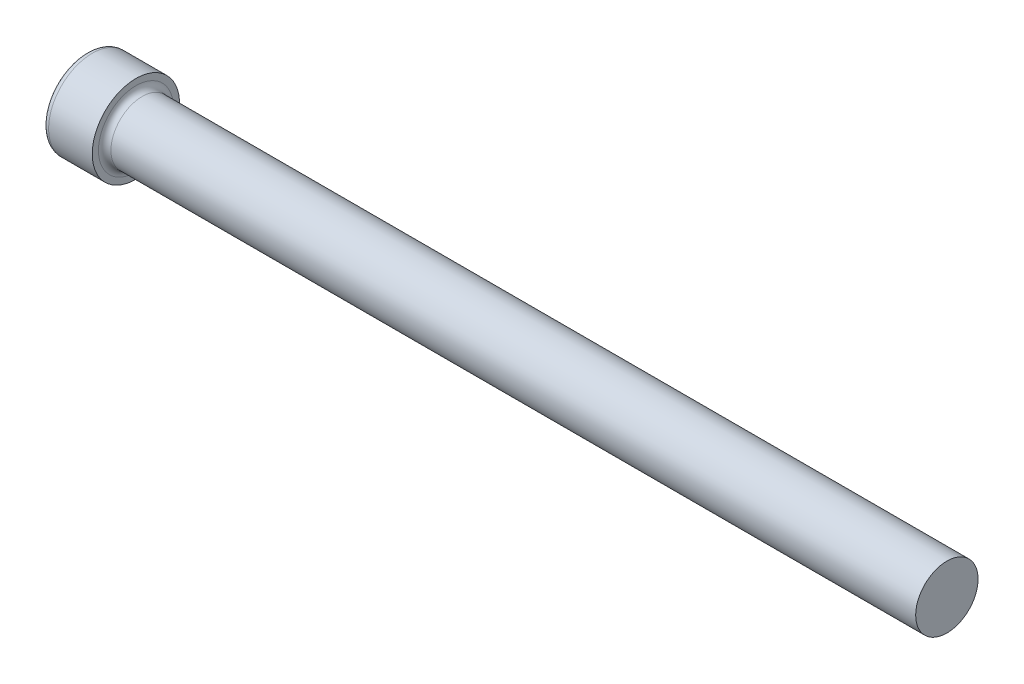
ISO-10303-21;
HEADER;
FILE_DESCRIPTION(('STEP AP214'),'2;1');
FILE_NAME('part.step','',(''),(''),'','','');
FILE_SCHEMA(('AUTOMOTIVE_DESIGN { 1 0 10303 214 1 1 1 1 }'));
ENDSEC;
DATA;
#1=APPLICATION_CONTEXT('core data for automotive mechanical design processes');
#2=APPLICATION_PROTOCOL_DEFINITION('international standard','automotive_design',2000,#1);
#3=PRODUCT_CONTEXT('',#1,'mechanical');
#4=PRODUCT('Part','Part','',(#3));
#5=PRODUCT_RELATED_PRODUCT_CATEGORY('part','',(#4));
#6=PRODUCT_DEFINITION_FORMATION('','',#4);
#7=PRODUCT_DEFINITION_CONTEXT('part definition',#1,'design');
#8=PRODUCT_DEFINITION('design','',#6,#7);
#9=PRODUCT_DEFINITION_SHAPE('','',#8);
#10=(LENGTH_UNIT() NAMED_UNIT(*) SI_UNIT(.MILLI.,.METRE.));
#11=(NAMED_UNIT(*) PLANE_ANGLE_UNIT() SI_UNIT($,.RADIAN.));
#12=(NAMED_UNIT(*) SI_UNIT($,.STERADIAN.) SOLID_ANGLE_UNIT());
#13=UNCERTAINTY_MEASURE_WITH_UNIT(LENGTH_MEASURE(1.E-05),#10,'distance_accuracy_value','');
#14=(GEOMETRIC_REPRESENTATION_CONTEXT(3) GLOBAL_UNCERTAINTY_ASSIGNED_CONTEXT((#13)) GLOBAL_UNIT_ASSIGNED_CONTEXT((#10,
#11,#12)) REPRESENTATION_CONTEXT('',''));
#15=CARTESIAN_POINT('',(0.,0.,0.));
#16=DIRECTION('',(0.,0.,1.));
#17=DIRECTION('',(1.,0.,0.));
#18=AXIS2_PLACEMENT_3D('',#15,#16,#17);
#19=CARTESIAN_POINT('',(2.,-1.73205080756888,0.));
#20=DIRECTION('',(0.,-0.866025403784439,0.5));
#21=DIRECTION('',(0.,-0.5,-0.866025403784439));
#22=AXIS2_PLACEMENT_3D('',#19,#20,#21);
#23=PLANE('',#22);
#24=DIRECTION('',(1.,0.,0.));
#25=VECTOR('',#24,1.);
#26=CARTESIAN_POINT('',(2.,-0.866025403784439,1.5));
#27=LINE('',#26,#25);
#28=CARTESIAN_POINT('',(0.,-0.86602540378444,1.5));
#29=VERTEX_POINT('',#28);
#30=CARTESIAN_POINT('',(2.,-0.86602540378444,1.5));
#31=VERTEX_POINT('',#30);
#32=EDGE_CURVE('E97',#29,#31,#27,.T.);
#33=ORIENTED_EDGE('',*,*,#32,.T.);
#34=DIRECTION('',(0.,-0.5,-0.866025403784439));
#35=VECTOR('',#34,1.);
#36=CARTESIAN_POINT('',(2.,-1.73205080756888,0.));
#37=LINE('',#36,#35);
#38=CARTESIAN_POINT('',(2.,-1.73205080756888,0.));
#39=VERTEX_POINT('',#38);
#40=EDGE_CURVE('E86',#39,#31,#37,.F.);
#41=ORIENTED_EDGE('',*,*,#40,.F.);
#42=DIRECTION('',(1.,0.,0.));
#43=VECTOR('',#42,1.);
#44=CARTESIAN_POINT('',(2.,-1.73205080756888,0.));
#45=LINE('',#44,#43);
#46=CARTESIAN_POINT('',(0.,-1.73205080756888,0.));
#47=VERTEX_POINT('',#46);
#48=EDGE_CURVE('E106',#39,#47,#45,.F.);
#49=ORIENTED_EDGE('',*,*,#48,.T.);
#50=DIRECTION('',(0.,-0.5,-0.866025403784439));
#51=VECTOR('',#50,1.);
#52=CARTESIAN_POINT('',(0.,-1.73205080756888,0.));
#53=LINE('',#52,#51);
#54=EDGE_CURVE('E81',#29,#47,#53,.T.);
#55=ORIENTED_EDGE('',*,*,#54,.F.);
#56=EDGE_LOOP('',(#33,#41,#49,#55));
#57=FACE_BOUND('',#56,.T.);
#58=ADVANCED_FACE('F17',(#57),#23,.F.);
#59=CARTESIAN_POINT('',(2.,-0.866025403784439,1.5));
#60=DIRECTION('',(0.,0.,1.));
#61=DIRECTION('',(0.,-1.,0.));
#62=AXIS2_PLACEMENT_3D('',#59,#60,#61);
#63=PLANE('',#62);
#64=DIRECTION('',(1.,0.,0.));
#65=VECTOR('',#64,1.);
#66=CARTESIAN_POINT('',(2.,0.866025403784439,1.5));
#67=LINE('',#66,#65);
#68=CARTESIAN_POINT('',(0.,0.866025403784439,1.5));
#69=VERTEX_POINT('',#68);
#70=CARTESIAN_POINT('',(2.,0.866025403784439,1.5));
#71=VERTEX_POINT('',#70);
#72=EDGE_CURVE('E102',#69,#71,#67,.T.);
#73=ORIENTED_EDGE('',*,*,#72,.T.);
#74=DIRECTION('',(0.,-1.,0.));
#75=VECTOR('',#74,1.);
#76=CARTESIAN_POINT('',(2.,-0.866025403784439,1.5));
#77=LINE('',#76,#75);
#78=EDGE_CURVE('E90',#31,#71,#77,.F.);
#79=ORIENTED_EDGE('',*,*,#78,.F.);
#80=ORIENTED_EDGE('',*,*,#32,.F.);
#81=DIRECTION('',(0.,-1.,0.));
#82=VECTOR('',#81,1.);
#83=CARTESIAN_POINT('',(0.,-0.866025403784439,1.5));
#84=LINE('',#83,#82);
#85=EDGE_CURVE('E104',#69,#29,#84,.T.);
#86=ORIENTED_EDGE('',*,*,#85,.F.);
#87=EDGE_LOOP('',(#73,#79,#80,#86));
#88=FACE_BOUND('',#87,.T.);
#89=ADVANCED_FACE('F100',(#88),#63,.F.);
#90=CARTESIAN_POINT('',(2.,-0.866025403784439,-1.5));
#91=DIRECTION('',(0.,-0.866025403784439,-0.5));
#92=DIRECTION('',(0.,0.5,-0.866025403784439));
#93=AXIS2_PLACEMENT_3D('',#90,#91,#92);
#94=PLANE('',#93);
#95=ORIENTED_EDGE('',*,*,#48,.F.);
#96=DIRECTION('',(0.,-0.500000000000001,0.866025403784438));
#97=VECTOR('',#96,1.);
#98=CARTESIAN_POINT('',(2.,-0.866025403784439,-1.5));
#99=LINE('',#98,#97);
#100=CARTESIAN_POINT('',(2.,-0.866025403784439,-1.5));
#101=VERTEX_POINT('',#100);
#102=EDGE_CURVE('E93',#101,#39,#99,.T.);
#103=ORIENTED_EDGE('',*,*,#102,.F.);
#104=DIRECTION('',(1.,0.,0.));
#105=VECTOR('',#104,1.);
#106=CARTESIAN_POINT('',(2.,-0.866025403784439,-1.5));
#107=LINE('',#106,#105);
#108=CARTESIAN_POINT('',(0.,-0.866025403784439,-1.5));
#109=VERTEX_POINT('',#108);
#110=EDGE_CURVE('E212',#101,#109,#107,.F.);
#111=ORIENTED_EDGE('',*,*,#110,.T.);
#112=DIRECTION('',(0.,0.5,-0.866025403784439));
#113=VECTOR('',#112,1.);
#114=CARTESIAN_POINT('',(0.,-0.866025403784439,-1.5));
#115=LINE('',#114,#113);
#116=EDGE_CURVE('E224',#47,#109,#115,.T.);
#117=ORIENTED_EDGE('',*,*,#116,.F.);
#118=EDGE_LOOP('',(#95,#103,#111,#117));
#119=FACE_BOUND('',#118,.T.);
#120=ADVANCED_FACE('F227',(#119),#94,.F.);
#121=CARTESIAN_POINT('',(2.,0.866025403784439,1.5));
#122=DIRECTION('',(0.,0.866025403784439,0.5));
#123=DIRECTION('',(0.,-0.5,0.866025403784439));
#124=AXIS2_PLACEMENT_3D('',#121,#122,#123);
#125=PLANE('',#124);
#126=DIRECTION('',(1.,0.,0.));
#127=VECTOR('',#126,1.);
#128=CARTESIAN_POINT('',(2.,1.73205080756888,0.));
#129=LINE('',#128,#127);
#130=CARTESIAN_POINT('',(0.,1.73205080756888,0.));
#131=VERTEX_POINT('',#130);
#132=CARTESIAN_POINT('',(2.,1.73205080756888,0.));
#133=VERTEX_POINT('',#132);
#134=EDGE_CURVE('E208',#131,#133,#129,.T.);
#135=ORIENTED_EDGE('',*,*,#134,.T.);
#136=DIRECTION('',(0.,0.500000000000001,-0.866025403784438));
#137=VECTOR('',#136,1.);
#138=CARTESIAN_POINT('',(2.,0.866025403784439,1.5));
#139=LINE('',#138,#137);
#140=EDGE_CURVE('E218',#71,#133,#139,.T.);
#141=ORIENTED_EDGE('',*,*,#140,.F.);
#142=ORIENTED_EDGE('',*,*,#72,.F.);
#143=DIRECTION('',(0.,-0.5,0.866025403784439));
#144=VECTOR('',#143,1.);
#145=CARTESIAN_POINT('',(0.,0.866025403784439,1.5));
#146=LINE('',#145,#144);
#147=EDGE_CURVE('E220',#131,#69,#146,.T.);
#148=ORIENTED_EDGE('',*,*,#147,.F.);
#149=EDGE_LOOP('',(#135,#141,#142,#148));
#150=FACE_BOUND('',#149,.T.);
#151=ADVANCED_FACE('F236',(#150),#125,.F.);
#152=CARTESIAN_POINT('',(2.,2.59807621135332,-1.5));
#153=DIRECTION('',(-1.,0.,0.));
#154=DIRECTION('',(0.,0.,1.));
#155=AXIS2_PLACEMENT_3D('',#152,#153,#154);
#156=PLANE('',#155);
#157=ORIENTED_EDGE('',*,*,#40,.T.);
#158=ORIENTED_EDGE('',*,*,#78,.T.);
#159=ORIENTED_EDGE('',*,*,#140,.T.);
#160=DIRECTION('',(0.,0.5,0.866025403784439));
#161=VECTOR('',#160,1.);
#162=CARTESIAN_POINT('',(2.,1.73205080756888,0.));
#163=LINE('',#162,#161);
#164=CARTESIAN_POINT('',(2.,0.86602540378444,-1.5));
#165=VERTEX_POINT('',#164);
#166=EDGE_CURVE('E206',#133,#165,#163,.F.);
#167=ORIENTED_EDGE('',*,*,#166,.T.);
#168=DIRECTION('',(0.,1.,0.));
#169=VECTOR('',#168,1.);
#170=CARTESIAN_POINT('',(2.,0.866025403784439,-1.5));
#171=LINE('',#170,#169);
#172=EDGE_CURVE('E215',#165,#101,#171,.F.);
#173=ORIENTED_EDGE('',*,*,#172,.T.);
#174=ORIENTED_EDGE('',*,*,#102,.T.);
#175=EDGE_LOOP('',(#157,#158,#159,#167,#173,#174));
#176=FACE_BOUND('',#175,.T.);
#177=ADVANCED_FACE('F87',(#176),#156,.T.);
#178=CARTESIAN_POINT('',(2.,0.866025403784439,-1.5));
#179=DIRECTION('',(0.,0.,-1.));
#180=DIRECTION('',(0.,1.,0.));
#181=AXIS2_PLACEMENT_3D('',#178,#179,#180);
#182=PLANE('',#181);
#183=ORIENTED_EDGE('',*,*,#110,.F.);
#184=ORIENTED_EDGE('',*,*,#172,.F.);
#185=DIRECTION('',(1.,0.,0.));
#186=VECTOR('',#185,1.);
#187=CARTESIAN_POINT('',(2.,0.866025403784441,-1.5));
#188=LINE('',#187,#186);
#189=CARTESIAN_POINT('',(0.,0.86602540378444,-1.5));
#190=VERTEX_POINT('',#189);
#191=EDGE_CURVE('E197',#165,#190,#188,.F.);
#192=ORIENTED_EDGE('',*,*,#191,.T.);
#193=DIRECTION('',(0.,1.,0.));
#194=VECTOR('',#193,1.);
#195=CARTESIAN_POINT('',(0.,0.866025403784439,-1.5));
#196=LINE('',#195,#194);
#197=EDGE_CURVE('E210',#109,#190,#196,.T.);
#198=ORIENTED_EDGE('',*,*,#197,.F.);
#199=EDGE_LOOP('',(#183,#184,#192,#198));
#200=FACE_BOUND('',#199,.T.);
#201=ADVANCED_FACE('F243',(#200),#182,.F.);
#202=CARTESIAN_POINT('',(2.,1.73205080756888,0.));
#203=DIRECTION('',(0.,0.866025403784439,-0.5));
#204=DIRECTION('',(0.,0.5,0.866025403784439));
#205=AXIS2_PLACEMENT_3D('',#202,#203,#204);
#206=PLANE('',#205);
#207=ORIENTED_EDGE('',*,*,#191,.F.);
#208=ORIENTED_EDGE('',*,*,#166,.F.);
#209=ORIENTED_EDGE('',*,*,#134,.F.);
#210=DIRECTION('',(0.,-0.500000000000001,-0.866025403784438));
#211=VECTOR('',#210,1.);
#212=CARTESIAN_POINT('',(0.,1.73205080756888,0.));
#213=LINE('',#212,#211);
#214=EDGE_CURVE('E205',#131,#190,#213,.T.);
#215=ORIENTED_EDGE('',*,*,#214,.T.);
#216=EDGE_LOOP('',(#207,#208,#209,#215));
#217=FACE_BOUND('',#216,.T.);
#218=ADVANCED_FACE('F241',(#217),#206,.F.);
#219=CARTESIAN_POINT('',(0.,0.,0.));
#220=DIRECTION('',(1.,0.,0.));
#221=DIRECTION('',(0.,0.,-1.));
#222=AXIS2_PLACEMENT_3D('',#219,#220,#221);
#223=PLANE('',#222);
#224=ORIENTED_EDGE('',*,*,#147,.T.);
#225=ORIENTED_EDGE('',*,*,#85,.T.);
#226=ORIENTED_EDGE('',*,*,#54,.T.);
#227=ORIENTED_EDGE('',*,*,#116,.T.);
#228=ORIENTED_EDGE('',*,*,#197,.T.);
#229=ORIENTED_EDGE('',*,*,#214,.F.);
#230=EDGE_LOOP('',(#224,#225,#226,#227,#228,#229));
#231=FACE_BOUND('',#230,.T.);
#232=CARTESIAN_POINT('',(0.,0.,0.));
#233=DIRECTION('',(1.,0.,0.));
#234=DIRECTION('',(0.,0.,-1.));
#235=AXIS2_PLACEMENT_3D('',#232,#233,#234);
#236=CIRCLE('',#235,3.);
#237=CARTESIAN_POINT('',(0.,0.,-3.));
#238=VERTEX_POINT('',#237);
#239=CARTESIAN_POINT('',(0.,0.,3.));
#240=VERTEX_POINT('',#239);
#241=EDGE_CURVE('E177',#238,#240,#236,.T.);
#242=ORIENTED_EDGE('',*,*,#241,.F.);
#243=CARTESIAN_POINT('',(0.,0.,0.));
#244=DIRECTION('',(1.,0.,0.));
#245=DIRECTION('',(0.,0.,1.));
#246=AXIS2_PLACEMENT_3D('',#243,#244,#245);
#247=CIRCLE('',#246,3.);
#248=EDGE_CURVE('E361',#240,#238,#247,.T.);
#249=ORIENTED_EDGE('',*,*,#248,.F.);
#250=EDGE_LOOP('',(#242,#249));
#251=FACE_BOUND('',#250,.T.);
#252=ADVANCED_FACE('F185',(#231,#251),#223,.F.);
#253=CARTESIAN_POINT('',(0.5,0.,0.));
#254=DIRECTION('',(1.,0.,0.));
#255=DIRECTION('',(0.,1.,0.));
#256=AXIS2_PLACEMENT_3D('',#253,#254,#255);
#257=TOROIDAL_SURFACE('',#256,3.,0.5);
#258=CARTESIAN_POINT('',(0.5,0.,0.));
#259=DIRECTION('',(-1.,0.,0.));
#260=DIRECTION('',(0.,0.,1.));
#261=AXIS2_PLACEMENT_3D('',#258,#259,#260);
#262=CIRCLE('',#261,3.5);
#263=CARTESIAN_POINT('',(0.5,0.,3.5));
#264=VERTEX_POINT('',#263);
#265=EDGE_CURVE('E117',#264,#264,#262,.F.);
#266=ORIENTED_EDGE('',*,*,#265,.F.);
#267=EDGE_LOOP('',(#266));
#268=FACE_BOUND('',#267,.T.);
#269=ORIENTED_EDGE('',*,*,#241,.T.);
#270=ORIENTED_EDGE('',*,*,#248,.T.);
#271=EDGE_LOOP('',(#269,#270));
#272=FACE_BOUND('',#271,.T.);
#273=ADVANCED_FACE('F181',(#268,#272),#257,.T.);
#274=CARTESIAN_POINT('',(0.,0.,0.));
#275=DIRECTION('',(-1.,0.,0.));
#276=DIRECTION('',(0.,0.,1.));
#277=AXIS2_PLACEMENT_3D('',#274,#275,#276);
#278=CYLINDRICAL_SURFACE('',#277,3.5);
#279=ORIENTED_EDGE('',*,*,#265,.T.);
#280=EDGE_LOOP('',(#279));
#281=FACE_BOUND('',#280,.T.);
#282=CARTESIAN_POINT('',(4.,0.,0.));
#283=DIRECTION('',(-1.,0.,0.));
#284=DIRECTION('',(0.,0.,1.));
#285=AXIS2_PLACEMENT_3D('',#282,#283,#284);
#286=CIRCLE('',#285,3.5);
#287=CARTESIAN_POINT('',(4.,0.,3.5));
#288=VERTEX_POINT('',#287);
#289=EDGE_CURVE('E114',#288,#288,#286,.T.);
#290=ORIENTED_EDGE('',*,*,#289,.T.);
#291=EDGE_LOOP('',(#290));
#292=FACE_BOUND('',#291,.T.);
#293=ADVANCED_FACE('F156',(#281,#292),#278,.T.);
#294=CARTESIAN_POINT('',(4.,3.5,0.));
#295=DIRECTION('',(-1.,0.,0.));
#296=DIRECTION('',(0.,0.,1.));
#297=AXIS2_PLACEMENT_3D('',#294,#295,#296);
#298=PLANE('',#297);
#299=ORIENTED_EDGE('',*,*,#289,.F.);
#300=EDGE_LOOP('',(#299));
#301=FACE_BOUND('',#300,.T.);
#302=CARTESIAN_POINT('',(4.,0.,0.));
#303=DIRECTION('',(1.,0.,0.));
#304=DIRECTION('',(0.,0.,1.));
#305=AXIS2_PLACEMENT_3D('',#302,#303,#304);
#306=CIRCLE('',#305,3.);
#307=CARTESIAN_POINT('',(4.,0.,-3.));
#308=VERTEX_POINT('',#307);
#309=CARTESIAN_POINT('',(4.,0.,3.));
#310=VERTEX_POINT('',#309);
#311=EDGE_CURVE('E113',#308,#310,#306,.F.);
#312=ORIENTED_EDGE('',*,*,#311,.T.);
#313=CARTESIAN_POINT('',(4.,0.,0.));
#314=DIRECTION('',(1.,0.,0.));
#315=DIRECTION('',(0.,0.,-1.));
#316=AXIS2_PLACEMENT_3D('',#313,#314,#315);
#317=CIRCLE('',#316,3.);
#318=EDGE_CURVE('E36',#310,#308,#317,.F.);
#319=ORIENTED_EDGE('',*,*,#318,.T.);
#320=EDGE_LOOP('',(#312,#319));
#321=FACE_BOUND('',#320,.T.);
#322=ADVANCED_FACE('F147',(#301,#321),#298,.F.);
#323=CARTESIAN_POINT('',(69.,0.,0.));
#324=DIRECTION('',(1.,0.,0.));
#325=DIRECTION('',(0.,0.,-1.));
#326=AXIS2_PLACEMENT_3D('',#323,#324,#325);
#327=PLANE('',#326);
#328=CARTESIAN_POINT('',(69.,0.,0.));
#329=DIRECTION('',(-1.,0.,0.));
#330=DIRECTION('',(0.,0.,1.));
#331=AXIS2_PLACEMENT_3D('',#328,#329,#330);
#332=CIRCLE('',#331,2.5);
#333=CARTESIAN_POINT('',(69.,0.,2.5));
#334=VERTEX_POINT('',#333);
#335=EDGE_CURVE('E28',#334,#334,#332,.T.);
#336=ORIENTED_EDGE('',*,*,#335,.F.);
#337=EDGE_LOOP('',(#336));
#338=FACE_BOUND('',#337,.T.);
#339=ADVANCED_FACE('F136',(#338),#327,.T.);
#340=CARTESIAN_POINT('',(4.5,0.,0.));
#341=DIRECTION('',(-1.,0.,0.));
#342=DIRECTION('',(0.,1.,0.));
#343=AXIS2_PLACEMENT_3D('',#340,#341,#342);
#344=TOROIDAL_SURFACE('',#343,3.,0.5);
#345=CARTESIAN_POINT('',(4.5,0.,0.));
#346=DIRECTION('',(-1.,0.,0.));
#347=DIRECTION('',(0.,0.,1.));
#348=AXIS2_PLACEMENT_3D('',#345,#346,#347);
#349=CIRCLE('',#348,2.5);
#350=CARTESIAN_POINT('',(4.5,0.,2.5));
#351=VERTEX_POINT('',#350);
#352=EDGE_CURVE('E11',#351,#351,#349,.F.);
#353=ORIENTED_EDGE('',*,*,#352,.F.);
#354=EDGE_LOOP('',(#353));
#355=FACE_BOUND('',#354,.T.);
#356=ORIENTED_EDGE('',*,*,#311,.F.);
#357=ORIENTED_EDGE('',*,*,#318,.F.);
#358=EDGE_LOOP('',(#356,#357));
#359=FACE_BOUND('',#358,.T.);
#360=ADVANCED_FACE('F124',(#355,#359),#344,.F.);
#361=CARTESIAN_POINT('',(0.,0.,0.));
#362=DIRECTION('',(-1.,0.,0.));
#363=DIRECTION('',(0.,0.,1.));
#364=AXIS2_PLACEMENT_3D('',#361,#362,#363);
#365=CYLINDRICAL_SURFACE('',#364,2.5);
#366=ORIENTED_EDGE('',*,*,#352,.T.);
#367=EDGE_LOOP('',(#366));
#368=FACE_BOUND('',#367,.T.);
#369=ORIENTED_EDGE('',*,*,#335,.T.);
#370=EDGE_LOOP('',(#369));
#371=FACE_BOUND('',#370,.T.);
#372=ADVANCED_FACE('F135',(#368,#371),#365,.T.);
#373=CLOSED_SHELL('',(#58,#89,#120,#151,#177,#201,#218,#252,#273,#293,#322,#339,#360,#372));
#374=MANIFOLD_SOLID_BREP('B1',#373);
#375=ADVANCED_BREP_SHAPE_REPRESENTATION('',(#18,#374),#14);
#376=SHAPE_DEFINITION_REPRESENTATION(#9,#375);
ENDSEC;
END-ISO-10303-21;
